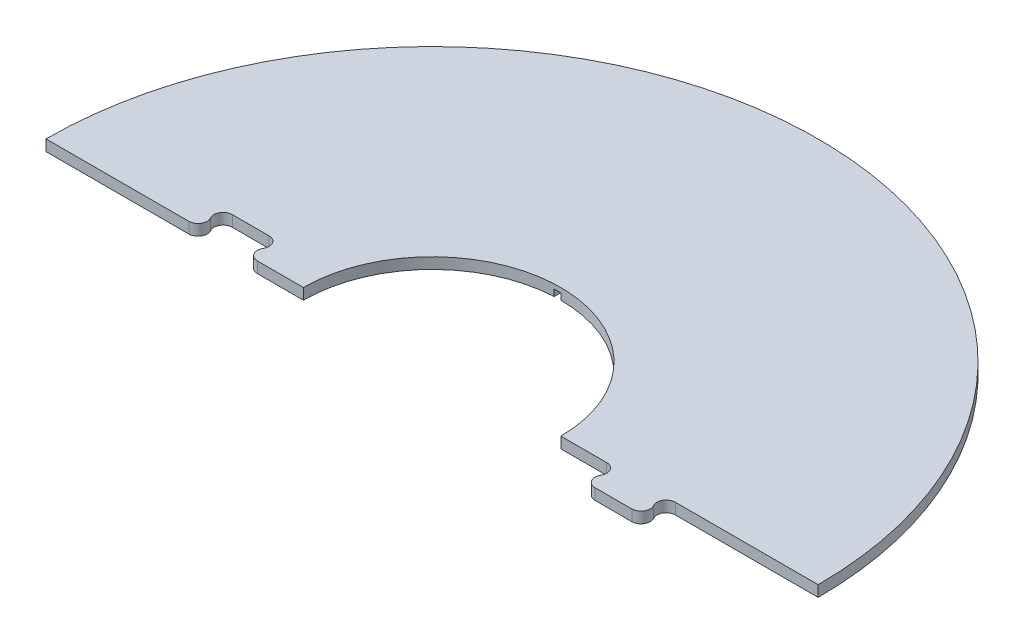
ISO-10303-21;
HEADER;
FILE_DESCRIPTION(('STEP AP214'),'2;1');
FILE_NAME('part.step','',(''),(''),'','','');
FILE_SCHEMA(('AUTOMOTIVE_DESIGN { 1 0 10303 214 1 1 1 1 }'));
ENDSEC;
DATA;
#1=APPLICATION_CONTEXT('core data for automotive mechanical design processes');
#2=APPLICATION_PROTOCOL_DEFINITION('international standard','automotive_design',2000,#1);
#3=PRODUCT_CONTEXT('',#1,'mechanical');
#4=PRODUCT('Part','Part','',(#3));
#5=PRODUCT_RELATED_PRODUCT_CATEGORY('part','',(#4));
#6=PRODUCT_DEFINITION_FORMATION('','',#4);
#7=PRODUCT_DEFINITION_CONTEXT('part definition',#1,'design');
#8=PRODUCT_DEFINITION('design','',#6,#7);
#9=PRODUCT_DEFINITION_SHAPE('','',#8);
#10=(LENGTH_UNIT() NAMED_UNIT(*) SI_UNIT(.MILLI.,.METRE.));
#11=(NAMED_UNIT(*) PLANE_ANGLE_UNIT() SI_UNIT($,.RADIAN.));
#12=(NAMED_UNIT(*) SI_UNIT($,.STERADIAN.) SOLID_ANGLE_UNIT());
#13=UNCERTAINTY_MEASURE_WITH_UNIT(LENGTH_MEASURE(1.E-05),#10,'distance_accuracy_value','');
#14=(GEOMETRIC_REPRESENTATION_CONTEXT(3) GLOBAL_UNCERTAINTY_ASSIGNED_CONTEXT((#13)) GLOBAL_UNIT_ASSIGNED_CONTEXT((#10,
#11,#12)) REPRESENTATION_CONTEXT('',''));
#15=CARTESIAN_POINT('',(0.,0.,0.));
#16=DIRECTION('',(0.,0.,1.));
#17=DIRECTION('',(1.,0.,0.));
#18=AXIS2_PLACEMENT_3D('',#15,#16,#17);
#19=CARTESIAN_POINT('',(0.,12.,0.));
#20=DIRECTION('',(0.,-1.,0.));
#21=DIRECTION('',(0.,0.,-1.));
#22=AXIS2_PLACEMENT_3D('',#19,#20,#21);
#23=CYLINDRICAL_SURFACE('',#22,420.);
#24=DIRECTION('',(0.,-1.,0.));
#25=VECTOR('',#24,1.);
#26=CARTESIAN_POINT('',(0.,7.,-420.));
#27=LINE('',#26,#25);
#28=CARTESIAN_POINT('',(0.,7.,-420.));
#29=VERTEX_POINT('',#28);
#30=CARTESIAN_POINT('',(0.,0.,-420.));
#31=VERTEX_POINT('',#30);
#32=EDGE_CURVE('E328',#29,#31,#27,.T.);
#33=ORIENTED_EDGE('',*,*,#32,.F.);
#34=CARTESIAN_POINT('',(0.,7.,0.));
#35=DIRECTION('',(0.,-1.,0.));
#36=DIRECTION('',(0.,0.,-1.));
#37=AXIS2_PLACEMENT_3D('',#34,#35,#36);
#38=CIRCLE('',#37,420.);
#39=CARTESIAN_POINT('',(-7.,7.,-419.941662615178));
#40=VERTEX_POINT('',#39);
#41=EDGE_CURVE('E323',#40,#29,#38,.T.);
#42=ORIENTED_EDGE('',*,*,#41,.F.);
#43=DIRECTION('',(0.,-1.,0.));
#44=VECTOR('',#43,1.);
#45=CARTESIAN_POINT('',(-7.,7.,-419.941662615178));
#46=LINE('',#45,#44);
#47=CARTESIAN_POINT('',(-7.,0.,-419.941662615178));
#48=VERTEX_POINT('',#47);
#49=EDGE_CURVE('E325',#40,#48,#46,.T.);
#50=ORIENTED_EDGE('',*,*,#49,.T.);
#51=CARTESIAN_POINT('',(0.,0.,0.));
#52=DIRECTION('',(0.,1.,0.));
#53=DIRECTION('',(0.,0.,1.));
#54=AXIS2_PLACEMENT_3D('',#51,#52,#53);
#55=CIRCLE('',#54,420.);
#56=CARTESIAN_POINT('',(-420.,0.,0.));
#57=VERTEX_POINT('',#56);
#58=EDGE_CURVE('E193',#48,#57,#55,.T.);
#59=ORIENTED_EDGE('',*,*,#58,.T.);
#60=DIRECTION('',(0.,-1.,0.));
#61=VECTOR('',#60,1.);
#62=CARTESIAN_POINT('',(-420.,12.,0.));
#63=LINE('',#62,#61);
#64=CARTESIAN_POINT('',(-420.,12.,0.));
#65=VERTEX_POINT('',#64);
#66=EDGE_CURVE('E11',#65,#57,#63,.T.);
#67=ORIENTED_EDGE('',*,*,#66,.F.);
#68=CARTESIAN_POINT('',(0.,12.,0.));
#69=DIRECTION('',(0.,1.,0.));
#70=DIRECTION('',(0.,0.,1.));
#71=AXIS2_PLACEMENT_3D('',#68,#69,#70);
#72=CIRCLE('',#71,420.);
#73=CARTESIAN_POINT('',(420.,12.,2.19641969265707E-06));
#74=VERTEX_POINT('',#73);
#75=EDGE_CURVE('E223',#74,#65,#72,.T.);
#76=ORIENTED_EDGE('',*,*,#75,.F.);
#77=DIRECTION('',(0.,-1.,0.));
#78=VECTOR('',#77,1.);
#79=CARTESIAN_POINT('',(420.,12.,2.19641969265707E-06));
#80=LINE('',#79,#78);
#81=CARTESIAN_POINT('',(420.,0.,2.19641969265707E-06));
#82=VERTEX_POINT('',#81);
#83=EDGE_CURVE('E185',#74,#82,#80,.T.);
#84=ORIENTED_EDGE('',*,*,#83,.T.);
#85=EDGE_CURVE('E189',#82,#31,#55,.T.);
#86=ORIENTED_EDGE('',*,*,#85,.T.);
#87=EDGE_LOOP('',(#33,#42,#50,#59,#67,#76,#84,#86));
#88=FACE_BOUND('',#87,.T.);
#89=ADVANCED_FACE('F33',(#88),#23,.T.);
#90=CARTESIAN_POINT('',(0.,12.,0.));
#91=DIRECTION('',(0.,-1.,0.));
#92=DIRECTION('',(0.,0.,-1.));
#93=AXIS2_PLACEMENT_3D('',#90,#91,#92);
#94=CYLINDRICAL_SURFACE('',#93,140.);
#95=DIRECTION('',(0.,-1.,0.));
#96=VECTOR('',#95,1.);
#97=CARTESIAN_POINT('',(0.,7.,-140.));
#98=LINE('',#97,#96);
#99=CARTESIAN_POINT('',(0.,7.,-140.));
#100=VERTEX_POINT('',#99);
#101=CARTESIAN_POINT('',(0.,0.,-140.));
#102=VERTEX_POINT('',#101);
#103=EDGE_CURVE('E320',#100,#102,#98,.T.);
#104=ORIENTED_EDGE('',*,*,#103,.T.);
#105=CARTESIAN_POINT('',(0.,0.,0.));
#106=DIRECTION('',(0.,-1.,0.));
#107=DIRECTION('',(0.,0.,1.));
#108=AXIS2_PLACEMENT_3D('',#105,#106,#107);
#109=CIRCLE('',#108,140.);
#110=CARTESIAN_POINT('',(140.,0.,2.13909844029186E-06));
#111=VERTEX_POINT('',#110);
#112=EDGE_CURVE('E207',#102,#111,#109,.T.);
#113=ORIENTED_EDGE('',*,*,#112,.T.);
#114=DIRECTION('',(0.,-1.,0.));
#115=VECTOR('',#114,1.);
#116=CARTESIAN_POINT('',(140.,12.,2.13909844029186E-06));
#117=LINE('',#116,#115);
#118=CARTESIAN_POINT('',(140.,12.,2.13909844029186E-06));
#119=VERTEX_POINT('',#118);
#120=EDGE_CURVE('E236',#119,#111,#117,.T.);
#121=ORIENTED_EDGE('',*,*,#120,.F.);
#122=CARTESIAN_POINT('',(0.,12.,0.));
#123=DIRECTION('',(0.,-1.,0.));
#124=DIRECTION('',(0.,0.,1.));
#125=AXIS2_PLACEMENT_3D('',#122,#123,#124);
#126=CIRCLE('',#125,140.);
#127=CARTESIAN_POINT('',(-140.,12.,0.));
#128=VERTEX_POINT('',#127);
#129=EDGE_CURVE('E291',#128,#119,#126,.T.);
#130=ORIENTED_EDGE('',*,*,#129,.F.);
#131=DIRECTION('',(0.,-1.,0.));
#132=VECTOR('',#131,1.);
#133=CARTESIAN_POINT('',(-140.,12.,0.));
#134=LINE('',#133,#132);
#135=CARTESIAN_POINT('',(-140.,0.,0.));
#136=VERTEX_POINT('',#135);
#137=EDGE_CURVE('E239',#128,#136,#134,.T.);
#138=ORIENTED_EDGE('',*,*,#137,.T.);
#139=CARTESIAN_POINT('',(-7.,0.,-139.824890488067));
#140=VERTEX_POINT('',#139);
#141=EDGE_CURVE('E208',#136,#140,#109,.T.);
#142=ORIENTED_EDGE('',*,*,#141,.T.);
#143=DIRECTION('',(0.,-1.,0.));
#144=VECTOR('',#143,1.);
#145=CARTESIAN_POINT('',(-7.,7.,-139.824890488067));
#146=LINE('',#145,#144);
#147=CARTESIAN_POINT('',(-7.,7.,-139.824890488067));
#148=VERTEX_POINT('',#147);
#149=EDGE_CURVE('E47',#148,#140,#146,.T.);
#150=ORIENTED_EDGE('',*,*,#149,.F.);
#151=CARTESIAN_POINT('',(0.,7.,0.));
#152=DIRECTION('',(0.,-1.,0.));
#153=DIRECTION('',(0.,0.,-1.));
#154=AXIS2_PLACEMENT_3D('',#151,#152,#153);
#155=CIRCLE('',#154,140.);
#156=EDGE_CURVE('E341',#100,#148,#155,.F.);
#157=ORIENTED_EDGE('',*,*,#156,.F.);
#158=EDGE_LOOP('',(#104,#113,#121,#130,#138,#142,#150,#157));
#159=FACE_BOUND('',#158,.T.);
#160=ADVANCED_FACE('F363',(#159),#94,.F.);
#161=CARTESIAN_POINT('',(0.,0.,0.));
#162=DIRECTION('',(0.,1.,0.));
#163=DIRECTION('',(0.,0.,1.));
#164=AXIS2_PLACEMENT_3D('',#161,#162,#163);
#165=PLANE('',#164);
#166=DIRECTION('',(0.,0.,-1.));
#167=VECTOR('',#166,1.);
#168=CARTESIAN_POINT('',(0.,0.,0.));
#169=LINE('',#168,#167);
#170=EDGE_CURVE('E334',#102,#31,#169,.T.);
#171=ORIENTED_EDGE('',*,*,#170,.T.);
#172=ORIENTED_EDGE('',*,*,#85,.F.);
#173=DIRECTION('',(1.,0.,2.04718433056436E-10));
#174=VECTOR('',#173,1.);
#175=CARTESIAN_POINT('',(420.,0.,2.19641969265707E-06));
#176=LINE('',#175,#174);
#177=CARTESIAN_POINT('',(264.641016151378,0.,2.1646148606197E-06));
#178=VERTEX_POINT('',#177);
#179=EDGE_CURVE('E113',#178,#82,#176,.T.);
#180=ORIENTED_EDGE('',*,*,#179,.F.);
#181=CARTESIAN_POINT('',(264.64101614933,0.,10.0000021646148));
#182=DIRECTION('',(0.,-1.,0.));
#183=DIRECTION('',(0.,0.,-1.));
#184=AXIS2_PLACEMENT_3D('',#181,#182,#183);
#185=CIRCLE('',#184,9.99999999999998);
#186=CARTESIAN_POINT('',(255.980762110463,0.,15.000002162842));
#187=VERTEX_POINT('',#186);
#188=EDGE_CURVE('E220',#187,#178,#185,.T.);
#189=ORIENTED_EDGE('',*,*,#188,.F.);
#190=CARTESIAN_POINT('',(247.320508071594,0.,20.000002161069));
#191=DIRECTION('',(0.,1.,0.));
#192=DIRECTION('',(0.,0.,1.));
#193=AXIS2_PLACEMENT_3D('',#190,#191,#192);
#194=CIRCLE('',#193,10.);
#195=CARTESIAN_POINT('',(247.320508069547,0.,30.000002161069));
#196=VERTEX_POINT('',#195);
#197=EDGE_CURVE('E177',#196,#187,#194,.T.);
#198=ORIENTED_EDGE('',*,*,#197,.F.);
#199=DIRECTION('',(1.,0.,2.04718794000192E-10));
#200=VECTOR('',#199,1.);
#201=CARTESIAN_POINT('',(207.320508069547,0.,30.0000021528803));
#202=LINE('',#201,#200);
#203=CARTESIAN_POINT('',(207.320508069547,0.,30.0000021528803));
#204=VERTEX_POINT('',#203);
#205=EDGE_CURVE('E217',#204,#196,#202,.T.);
#206=ORIENTED_EDGE('',*,*,#205,.F.);
#207=CARTESIAN_POINT('',(207.320508071594,0.,20.0000021528802));
#208=DIRECTION('',(0.,1.,0.));
#209=DIRECTION('',(0.,0.,-1.));
#210=AXIS2_PLACEMENT_3D('',#207,#208,#209);
#211=CIRCLE('',#210,10.);
#212=CARTESIAN_POINT('',(198.660254034774,0.,15.0000021511073));
#213=VERTEX_POINT('',#212);
#214=EDGE_CURVE('E215',#213,#204,#211,.T.);
#215=ORIENTED_EDGE('',*,*,#214,.F.);
#216=CARTESIAN_POINT('',(189.999999997953,0.,10.0000021493344));
#217=DIRECTION('',(0.,-1.,0.));
#218=DIRECTION('',(0.,0.,-1.));
#219=AXIS2_PLACEMENT_3D('',#216,#217,#218);
#220=CIRCLE('',#219,10.);
#221=CARTESIAN_POINT('',(190.,0.,2.14933444157348E-06));
#222=VERTEX_POINT('',#221);
#223=EDGE_CURVE('E213',#222,#213,#220,.T.);
#224=ORIENTED_EDGE('',*,*,#223,.F.);
#225=DIRECTION('',(1.,0.,2.04719746806767E-10));
#226=VECTOR('',#225,1.);
#227=CARTESIAN_POINT('',(190.,0.,2.14933444157348E-06));
#228=LINE('',#227,#226);
#229=EDGE_CURVE('E211',#111,#222,#228,.T.);
#230=ORIENTED_EDGE('',*,*,#229,.F.);
#231=ORIENTED_EDGE('',*,*,#112,.F.);
#232=EDGE_LOOP('',(#171,#172,#180,#189,#198,#206,#215,#224,#230,#231));
#233=FACE_BOUND('',#232,.T.);
#234=ADVANCED_FACE('F310',(#233),#165,.F.);
#235=CARTESIAN_POINT('',(-420.,12.,0.));
#236=DIRECTION('',(0.,0.,-1.));
#237=DIRECTION('',(-1.,0.,0.));
#238=AXIS2_PLACEMENT_3D('',#235,#236,#237);
#239=PLANE('',#238);
#240=DIRECTION('',(1.,0.,0.));
#241=VECTOR('',#240,1.);
#242=CARTESIAN_POINT('',(-420.,0.,0.));
#243=LINE('',#242,#241);
#244=CARTESIAN_POINT('',(-264.641016151378,0.,0.));
#245=VERTEX_POINT('',#244);
#246=EDGE_CURVE('E192',#57,#245,#243,.T.);
#247=ORIENTED_EDGE('',*,*,#246,.T.);
#248=DIRECTION('',(0.,-1.,0.));
#249=VECTOR('',#248,1.);
#250=CARTESIAN_POINT('',(-264.641016151378,12.,0.));
#251=LINE('',#250,#249);
#252=CARTESIAN_POINT('',(-264.641016151378,12.,0.));
#253=VERTEX_POINT('',#252);
#254=EDGE_CURVE('E40',#253,#245,#251,.T.);
#255=ORIENTED_EDGE('',*,*,#254,.F.);
#256=DIRECTION('',(1.,0.,0.));
#257=VECTOR('',#256,1.);
#258=CARTESIAN_POINT('',(-420.,12.,0.));
#259=LINE('',#258,#257);
#260=EDGE_CURVE('E121',#65,#253,#259,.T.);
#261=ORIENTED_EDGE('',*,*,#260,.F.);
#262=ORIENTED_EDGE('',*,*,#66,.T.);
#263=EDGE_LOOP('',(#247,#255,#261,#262));
#264=FACE_BOUND('',#263,.T.);
#265=ADVANCED_FACE('F409',(#264),#239,.F.);
#266=CARTESIAN_POINT('',(-264.641016151378,12.,-10.));
#267=DIRECTION('',(0.,-1.,0.));
#268=DIRECTION('',(0.,0.,-1.));
#269=AXIS2_PLACEMENT_3D('',#266,#267,#268);
#270=CYLINDRICAL_SURFACE('',#269,10.);
#271=CARTESIAN_POINT('',(-264.641016151378,0.,-10.));
#272=DIRECTION('',(0.,1.,0.));
#273=DIRECTION('',(0.,0.,-1.));
#274=AXIS2_PLACEMENT_3D('',#271,#272,#273);
#275=CIRCLE('',#274,10.);
#276=CARTESIAN_POINT('',(-255.980762113533,0.,-15.));
#277=VERTEX_POINT('',#276);
#278=EDGE_CURVE('E195',#245,#277,#275,.T.);
#279=ORIENTED_EDGE('',*,*,#278,.T.);
#280=DIRECTION('',(0.,-1.,0.));
#281=VECTOR('',#280,1.);
#282=CARTESIAN_POINT('',(-255.980762113533,12.,-15.));
#283=LINE('',#282,#281);
#284=CARTESIAN_POINT('',(-255.980762113533,12.,-15.));
#285=VERTEX_POINT('',#284);
#286=EDGE_CURVE('E254',#285,#277,#283,.T.);
#287=ORIENTED_EDGE('',*,*,#286,.F.);
#288=CARTESIAN_POINT('',(-264.641016151378,12.,-10.));
#289=DIRECTION('',(0.,1.,0.));
#290=DIRECTION('',(0.,0.,-1.));
#291=AXIS2_PLACEMENT_3D('',#288,#289,#290);
#292=CIRCLE('',#291,10.);
#293=EDGE_CURVE('E262',#253,#285,#292,.T.);
#294=ORIENTED_EDGE('',*,*,#293,.F.);
#295=ORIENTED_EDGE('',*,*,#254,.T.);
#296=EDGE_LOOP('',(#279,#287,#294,#295));
#297=FACE_BOUND('',#296,.T.);
#298=ADVANCED_FACE('F260',(#297),#270,.T.);
#299=CARTESIAN_POINT('',(-247.320508075689,12.,-20.));
#300=DIRECTION('',(0.,-1.,0.));
#301=DIRECTION('',(0.,0.,-1.));
#302=AXIS2_PLACEMENT_3D('',#299,#300,#301);
#303=CYLINDRICAL_SURFACE('',#302,9.99999999999999);
#304=CARTESIAN_POINT('',(-247.320508075689,0.,-20.));
#305=DIRECTION('',(0.,-1.,0.));
#306=DIRECTION('',(0.,0.,1.));
#307=AXIS2_PLACEMENT_3D('',#304,#305,#306);
#308=CIRCLE('',#307,9.99999999999999);
#309=CARTESIAN_POINT('',(-247.320508075689,0.,-30.));
#310=VERTEX_POINT('',#309);
#311=EDGE_CURVE('E197',#277,#310,#308,.T.);
#312=ORIENTED_EDGE('',*,*,#311,.T.);
#313=DIRECTION('',(0.,-1.,0.));
#314=VECTOR('',#313,1.);
#315=CARTESIAN_POINT('',(-247.320508075689,12.,-30.));
#316=LINE('',#315,#314);
#317=CARTESIAN_POINT('',(-247.320508075689,12.,-30.));
#318=VERTEX_POINT('',#317);
#319=EDGE_CURVE('E251',#318,#310,#316,.T.);
#320=ORIENTED_EDGE('',*,*,#319,.F.);
#321=CARTESIAN_POINT('',(-247.320508075689,12.,-20.));
#322=DIRECTION('',(0.,-1.,0.));
#323=DIRECTION('',(0.,0.,1.));
#324=AXIS2_PLACEMENT_3D('',#321,#322,#323);
#325=CIRCLE('',#324,9.99999999999999);
#326=EDGE_CURVE('E281',#285,#318,#325,.T.);
#327=ORIENTED_EDGE('',*,*,#326,.F.);
#328=ORIENTED_EDGE('',*,*,#286,.T.);
#329=EDGE_LOOP('',(#312,#320,#327,#328));
#330=FACE_BOUND('',#329,.T.);
#331=ADVANCED_FACE('F272',(#330),#303,.F.);
#332=CARTESIAN_POINT('',(-207.320508075689,12.,-30.));
#333=DIRECTION('',(0.,0.,-1.));
#334=DIRECTION('',(-1.,0.,0.));
#335=AXIS2_PLACEMENT_3D('',#332,#333,#334);
#336=PLANE('',#335);
#337=DIRECTION('',(1.,0.,0.));
#338=VECTOR('',#337,1.);
#339=CARTESIAN_POINT('',(-207.320508075689,0.,-30.));
#340=LINE('',#339,#338);
#341=CARTESIAN_POINT('',(-207.320508075689,0.,-30.));
#342=VERTEX_POINT('',#341);
#343=EDGE_CURVE('E199',#310,#342,#340,.T.);
#344=ORIENTED_EDGE('',*,*,#343,.T.);
#345=DIRECTION('',(0.,-1.,0.));
#346=VECTOR('',#345,1.);
#347=CARTESIAN_POINT('',(-207.320508075689,12.,-30.));
#348=LINE('',#347,#346);
#349=CARTESIAN_POINT('',(-207.320508075689,12.,-30.));
#350=VERTEX_POINT('',#349);
#351=EDGE_CURVE('E248',#350,#342,#348,.T.);
#352=ORIENTED_EDGE('',*,*,#351,.F.);
#353=DIRECTION('',(1.,0.,0.));
#354=VECTOR('',#353,1.);
#355=CARTESIAN_POINT('',(-207.320508075689,12.,-30.));
#356=LINE('',#355,#354);
#357=EDGE_CURVE('E278',#318,#350,#356,.T.);
#358=ORIENTED_EDGE('',*,*,#357,.F.);
#359=ORIENTED_EDGE('',*,*,#319,.T.);
#360=EDGE_LOOP('',(#344,#352,#358,#359));
#361=FACE_BOUND('',#360,.T.);
#362=ADVANCED_FACE('F276',(#361),#336,.F.);
#363=CARTESIAN_POINT('',(-207.320508075689,12.,-20.));
#364=DIRECTION('',(0.,-1.,0.));
#365=DIRECTION('',(0.,0.,-1.));
#366=AXIS2_PLACEMENT_3D('',#363,#364,#365);
#367=CYLINDRICAL_SURFACE('',#366,10.);
#368=CARTESIAN_POINT('',(-207.320508075689,0.,-20.));
#369=DIRECTION('',(0.,-1.,0.));
#370=DIRECTION('',(0.,0.,-1.));
#371=AXIS2_PLACEMENT_3D('',#368,#369,#370);
#372=CIRCLE('',#371,10.);
#373=CARTESIAN_POINT('',(-198.660254037844,0.,-15.));
#374=VERTEX_POINT('',#373);
#375=EDGE_CURVE('E201',#342,#374,#372,.T.);
#376=ORIENTED_EDGE('',*,*,#375,.T.);
#377=DIRECTION('',(0.,-1.,0.));
#378=VECTOR('',#377,1.);
#379=CARTESIAN_POINT('',(-198.660254037844,12.,-15.));
#380=LINE('',#379,#378);
#381=CARTESIAN_POINT('',(-198.660254037844,12.,-15.));
#382=VERTEX_POINT('',#381);
#383=EDGE_CURVE('E245',#382,#374,#380,.T.);
#384=ORIENTED_EDGE('',*,*,#383,.F.);
#385=CARTESIAN_POINT('',(-207.320508075689,12.,-20.));
#386=DIRECTION('',(0.,-1.,0.));
#387=DIRECTION('',(0.,0.,-1.));
#388=AXIS2_PLACEMENT_3D('',#385,#386,#387);
#389=CIRCLE('',#388,10.);
#390=EDGE_CURVE('E280',#350,#382,#389,.T.);
#391=ORIENTED_EDGE('',*,*,#390,.F.);
#392=ORIENTED_EDGE('',*,*,#351,.T.);
#393=EDGE_LOOP('',(#376,#384,#391,#392));
#394=FACE_BOUND('',#393,.T.);
#395=ADVANCED_FACE('F385',(#394),#367,.F.);
#396=CARTESIAN_POINT('',(-190.,12.,-10.));
#397=DIRECTION('',(0.,-1.,0.));
#398=DIRECTION('',(0.,0.,-1.));
#399=AXIS2_PLACEMENT_3D('',#396,#397,#398);
#400=CYLINDRICAL_SURFACE('',#399,10.);
#401=CARTESIAN_POINT('',(-190.,0.,-10.));
#402=DIRECTION('',(0.,1.,0.));
#403=DIRECTION('',(0.,0.,-1.));
#404=AXIS2_PLACEMENT_3D('',#401,#402,#403);
#405=CIRCLE('',#404,10.);
#406=CARTESIAN_POINT('',(-190.,0.,0.));
#407=VERTEX_POINT('',#406);
#408=EDGE_CURVE('E203',#374,#407,#405,.T.);
#409=ORIENTED_EDGE('',*,*,#408,.T.);
#410=DIRECTION('',(0.,-1.,0.));
#411=VECTOR('',#410,1.);
#412=CARTESIAN_POINT('',(-190.,12.,0.));
#413=LINE('',#412,#411);
#414=CARTESIAN_POINT('',(-190.,12.,0.));
#415=VERTEX_POINT('',#414);
#416=EDGE_CURVE('E242',#415,#407,#413,.T.);
#417=ORIENTED_EDGE('',*,*,#416,.F.);
#418=CARTESIAN_POINT('',(-190.,12.,-10.));
#419=DIRECTION('',(0.,1.,0.));
#420=DIRECTION('',(0.,0.,-1.));
#421=AXIS2_PLACEMENT_3D('',#418,#419,#420);
#422=CIRCLE('',#421,10.);
#423=EDGE_CURVE('E283',#382,#415,#422,.T.);
#424=ORIENTED_EDGE('',*,*,#423,.F.);
#425=ORIENTED_EDGE('',*,*,#383,.T.);
#426=EDGE_LOOP('',(#409,#417,#424,#425));
#427=FACE_BOUND('',#426,.T.);
#428=ADVANCED_FACE('F381',(#427),#400,.T.);
#429=CARTESIAN_POINT('',(-190.,12.,0.));
#430=DIRECTION('',(0.,0.,-1.));
#431=DIRECTION('',(-1.,0.,0.));
#432=AXIS2_PLACEMENT_3D('',#429,#430,#431);
#433=PLANE('',#432);
#434=DIRECTION('',(1.,0.,0.));
#435=VECTOR('',#434,1.);
#436=CARTESIAN_POINT('',(-190.,0.,0.));
#437=LINE('',#436,#435);
#438=EDGE_CURVE('E205',#407,#136,#437,.T.);
#439=ORIENTED_EDGE('',*,*,#438,.T.);
#440=ORIENTED_EDGE('',*,*,#137,.F.);
#441=DIRECTION('',(1.,0.,0.));
#442=VECTOR('',#441,1.);
#443=CARTESIAN_POINT('',(-190.,12.,0.));
#444=LINE('',#443,#442);
#445=EDGE_CURVE('E289',#415,#128,#444,.T.);
#446=ORIENTED_EDGE('',*,*,#445,.F.);
#447=ORIENTED_EDGE('',*,*,#416,.T.);
#448=EDGE_LOOP('',(#439,#440,#446,#447));
#449=FACE_BOUND('',#448,.T.);
#450=ADVANCED_FACE('F377',(#449),#433,.F.);
#451=CARTESIAN_POINT('',(190.,12.,2.14933444157348E-06));
#452=DIRECTION('',(2.04719746806767E-10,0.,-1.));
#453=DIRECTION('',(-1.,0.,-2.04719746806767E-10));
#454=AXIS2_PLACEMENT_3D('',#451,#452,#453);
#455=PLANE('',#454);
#456=ORIENTED_EDGE('',*,*,#229,.T.);
#457=DIRECTION('',(0.,-1.,0.));
#458=VECTOR('',#457,1.);
#459=CARTESIAN_POINT('',(190.,12.,2.14933444157348E-06));
#460=LINE('',#459,#458);
#461=CARTESIAN_POINT('',(190.,12.,2.14933444157348E-06));
#462=VERTEX_POINT('',#461);
#463=EDGE_CURVE('E233',#462,#222,#460,.T.);
#464=ORIENTED_EDGE('',*,*,#463,.F.);
#465=DIRECTION('',(1.,0.,2.04719746806767E-10));
#466=VECTOR('',#465,1.);
#467=CARTESIAN_POINT('',(190.,12.,2.14933444157348E-06));
#468=LINE('',#467,#466);
#469=EDGE_CURVE('E293',#119,#462,#468,.T.);
#470=ORIENTED_EDGE('',*,*,#469,.F.);
#471=ORIENTED_EDGE('',*,*,#120,.T.);
#472=EDGE_LOOP('',(#456,#464,#470,#471));
#473=FACE_BOUND('',#472,.T.);
#474=ADVANCED_FACE('F389',(#473),#455,.F.);
#475=CARTESIAN_POINT('',(189.999999997953,12.,10.0000021493344));
#476=DIRECTION('',(0.,-1.,0.));
#477=DIRECTION('',(0.,0.,-1.));
#478=AXIS2_PLACEMENT_3D('',#475,#476,#477);
#479=CYLINDRICAL_SURFACE('',#478,10.);
#480=ORIENTED_EDGE('',*,*,#223,.T.);
#481=DIRECTION('',(0.,-1.,0.));
#482=VECTOR('',#481,1.);
#483=CARTESIAN_POINT('',(198.660254034774,12.,15.0000021511073));
#484=LINE('',#483,#482);
#485=CARTESIAN_POINT('',(198.660254034774,12.,15.0000021511073));
#486=VERTEX_POINT('',#485);
#487=EDGE_CURVE('E230',#486,#213,#484,.T.);
#488=ORIENTED_EDGE('',*,*,#487,.F.);
#489=CARTESIAN_POINT('',(189.999999997953,12.,10.0000021493344));
#490=DIRECTION('',(0.,-1.,0.));
#491=DIRECTION('',(0.,0.,-1.));
#492=AXIS2_PLACEMENT_3D('',#489,#490,#491);
#493=CIRCLE('',#492,10.);
#494=EDGE_CURVE('E295',#462,#486,#493,.T.);
#495=ORIENTED_EDGE('',*,*,#494,.F.);
#496=ORIENTED_EDGE('',*,*,#463,.T.);
#497=EDGE_LOOP('',(#480,#488,#495,#496));
#498=FACE_BOUND('',#497,.T.);
#499=ADVANCED_FACE('F392',(#498),#479,.F.);
#500=CARTESIAN_POINT('',(207.320508071594,12.,20.0000021528802));
#501=DIRECTION('',(0.,-1.,0.));
#502=DIRECTION('',(0.,0.,-1.));
#503=AXIS2_PLACEMENT_3D('',#500,#501,#502);
#504=CYLINDRICAL_SURFACE('',#503,10.);
#505=ORIENTED_EDGE('',*,*,#214,.T.);
#506=DIRECTION('',(0.,-1.,0.));
#507=VECTOR('',#506,1.);
#508=CARTESIAN_POINT('',(207.320508069547,12.,30.0000021528803));
#509=LINE('',#508,#507);
#510=CARTESIAN_POINT('',(207.320508069547,12.,30.0000021528803));
#511=VERTEX_POINT('',#510);
#512=EDGE_CURVE('E227',#511,#204,#509,.T.);
#513=ORIENTED_EDGE('',*,*,#512,.F.);
#514=CARTESIAN_POINT('',(207.320508071594,12.,20.0000021528802));
#515=DIRECTION('',(0.,1.,0.));
#516=DIRECTION('',(0.,0.,-1.));
#517=AXIS2_PLACEMENT_3D('',#514,#515,#516);
#518=CIRCLE('',#517,10.);
#519=EDGE_CURVE('E297',#486,#511,#518,.T.);
#520=ORIENTED_EDGE('',*,*,#519,.F.);
#521=ORIENTED_EDGE('',*,*,#487,.T.);
#522=EDGE_LOOP('',(#505,#513,#520,#521));
#523=FACE_BOUND('',#522,.T.);
#524=ADVANCED_FACE('F303',(#523),#504,.T.);
#525=CARTESIAN_POINT('',(207.320508069547,12.,30.0000021528803));
#526=DIRECTION('',(2.04718794000192E-10,0.,-1.));
#527=DIRECTION('',(-1.,0.,-2.04718794000192E-10));
#528=AXIS2_PLACEMENT_3D('',#525,#526,#527);
#529=PLANE('',#528);
#530=ORIENTED_EDGE('',*,*,#205,.T.);
#531=DIRECTION('',(0.,-1.,0.));
#532=VECTOR('',#531,1.);
#533=CARTESIAN_POINT('',(247.320508069547,12.,30.000002161069));
#534=LINE('',#533,#532);
#535=CARTESIAN_POINT('',(247.320508069547,12.,30.000002161069));
#536=VERTEX_POINT('',#535);
#537=EDGE_CURVE('E180',#536,#196,#534,.T.);
#538=ORIENTED_EDGE('',*,*,#537,.F.);
#539=DIRECTION('',(1.,0.,2.04718794000192E-10));
#540=VECTOR('',#539,1.);
#541=CARTESIAN_POINT('',(207.320508069547,12.,30.0000021528803));
#542=LINE('',#541,#540);
#543=EDGE_CURVE('E168',#511,#536,#542,.T.);
#544=ORIENTED_EDGE('',*,*,#543,.F.);
#545=ORIENTED_EDGE('',*,*,#512,.T.);
#546=EDGE_LOOP('',(#530,#538,#544,#545));
#547=FACE_BOUND('',#546,.T.);
#548=ADVANCED_FACE('F307',(#547),#529,.F.);
#549=CARTESIAN_POINT('',(247.320508071594,12.,20.000002161069));
#550=DIRECTION('',(0.,-1.,0.));
#551=DIRECTION('',(0.,0.,-1.));
#552=AXIS2_PLACEMENT_3D('',#549,#550,#551);
#553=CYLINDRICAL_SURFACE('',#552,10.);
#554=ORIENTED_EDGE('',*,*,#197,.T.);
#555=DIRECTION('',(0.,-1.,0.));
#556=VECTOR('',#555,1.);
#557=CARTESIAN_POINT('',(255.980762110463,12.,15.000002162842));
#558=LINE('',#557,#556);
#559=CARTESIAN_POINT('',(255.980762110463,12.,15.000002162842));
#560=VERTEX_POINT('',#559);
#561=EDGE_CURVE('E174',#560,#187,#558,.T.);
#562=ORIENTED_EDGE('',*,*,#561,.F.);
#563=CARTESIAN_POINT('',(247.320508071594,12.,20.000002161069));
#564=DIRECTION('',(0.,1.,0.));
#565=DIRECTION('',(0.,0.,1.));
#566=AXIS2_PLACEMENT_3D('',#563,#564,#565);
#567=CIRCLE('',#566,10.);
#568=EDGE_CURVE('E161',#536,#560,#567,.T.);
#569=ORIENTED_EDGE('',*,*,#568,.F.);
#570=ORIENTED_EDGE('',*,*,#537,.T.);
#571=EDGE_LOOP('',(#554,#562,#569,#570));
#572=FACE_BOUND('',#571,.T.);
#573=ADVANCED_FACE('F175',(#572),#553,.T.);
#574=CARTESIAN_POINT('',(264.64101614933,12.,10.0000021646148));
#575=DIRECTION('',(0.,-1.,0.));
#576=DIRECTION('',(0.,0.,-1.));
#577=AXIS2_PLACEMENT_3D('',#574,#575,#576);
#578=CYLINDRICAL_SURFACE('',#577,9.99999999999998);
#579=ORIENTED_EDGE('',*,*,#188,.T.);
#580=DIRECTION('',(0.,-1.,0.));
#581=VECTOR('',#580,1.);
#582=CARTESIAN_POINT('',(264.641016151378,12.,2.1646148606197E-06));
#583=LINE('',#582,#581);
#584=CARTESIAN_POINT('',(264.641016151378,12.,2.1646148606197E-06));
#585=VERTEX_POINT('',#584);
#586=EDGE_CURVE('E181',#585,#178,#583,.T.);
#587=ORIENTED_EDGE('',*,*,#586,.F.);
#588=CARTESIAN_POINT('',(264.64101614933,12.,10.0000021646148));
#589=DIRECTION('',(0.,-1.,0.));
#590=DIRECTION('',(0.,0.,-1.));
#591=AXIS2_PLACEMENT_3D('',#588,#589,#590);
#592=CIRCLE('',#591,9.99999999999998);
#593=EDGE_CURVE('E165',#560,#585,#592,.T.);
#594=ORIENTED_EDGE('',*,*,#593,.F.);
#595=ORIENTED_EDGE('',*,*,#561,.T.);
#596=EDGE_LOOP('',(#579,#587,#594,#595));
#597=FACE_BOUND('',#596,.T.);
#598=ADVANCED_FACE('F183',(#597),#578,.F.);
#599=CARTESIAN_POINT('',(420.,12.,2.19641969265707E-06));
#600=DIRECTION('',(2.04718433056436E-10,0.,-1.));
#601=DIRECTION('',(-1.,0.,-2.04718433056436E-10));
#602=AXIS2_PLACEMENT_3D('',#599,#600,#601);
#603=PLANE('',#602);
#604=ORIENTED_EDGE('',*,*,#179,.T.);
#605=ORIENTED_EDGE('',*,*,#83,.F.);
#606=DIRECTION('',(1.,0.,2.04718433056436E-10));
#607=VECTOR('',#606,1.);
#608=CARTESIAN_POINT('',(420.,12.,2.19641969265707E-06));
#609=LINE('',#608,#607);
#610=EDGE_CURVE('E56',#585,#74,#609,.T.);
#611=ORIENTED_EDGE('',*,*,#610,.F.);
#612=ORIENTED_EDGE('',*,*,#586,.T.);
#613=EDGE_LOOP('',(#604,#605,#611,#612));
#614=FACE_BOUND('',#613,.T.);
#615=ADVANCED_FACE('F312',(#614),#603,.F.);
#616=CARTESIAN_POINT('',(0.,12.,0.));
#617=DIRECTION('',(0.,1.,0.));
#618=DIRECTION('',(0.,0.,1.));
#619=AXIS2_PLACEMENT_3D('',#616,#617,#618);
#620=PLANE('',#619);
#621=ORIENTED_EDGE('',*,*,#75,.T.);
#622=ORIENTED_EDGE('',*,*,#260,.T.);
#623=ORIENTED_EDGE('',*,*,#293,.T.);
#624=ORIENTED_EDGE('',*,*,#326,.T.);
#625=ORIENTED_EDGE('',*,*,#357,.T.);
#626=ORIENTED_EDGE('',*,*,#390,.T.);
#627=ORIENTED_EDGE('',*,*,#423,.T.);
#628=ORIENTED_EDGE('',*,*,#445,.T.);
#629=ORIENTED_EDGE('',*,*,#129,.T.);
#630=ORIENTED_EDGE('',*,*,#469,.T.);
#631=ORIENTED_EDGE('',*,*,#494,.T.);
#632=ORIENTED_EDGE('',*,*,#519,.T.);
#633=ORIENTED_EDGE('',*,*,#543,.T.);
#634=ORIENTED_EDGE('',*,*,#568,.T.);
#635=ORIENTED_EDGE('',*,*,#593,.T.);
#636=ORIENTED_EDGE('',*,*,#610,.T.);
#637=EDGE_LOOP('',(#621,#622,#623,#624,#625,#626,#627,#628,#629,#630,#631,#632,#633,#634,#635,#636));
#638=FACE_BOUND('',#637,.T.);
#639=ADVANCED_FACE('F163',(#638),#620,.T.);
#640=ORIENTED_EDGE('',*,*,#58,.F.);
#641=DIRECTION('',(0.,0.,-1.));
#642=VECTOR('',#641,1.);
#643=CARTESIAN_POINT('',(-7.,0.,0.));
#644=LINE('',#643,#642);
#645=EDGE_CURVE('E331',#140,#48,#644,.T.);
#646=ORIENTED_EDGE('',*,*,#645,.F.);
#647=ORIENTED_EDGE('',*,*,#141,.F.);
#648=ORIENTED_EDGE('',*,*,#438,.F.);
#649=ORIENTED_EDGE('',*,*,#408,.F.);
#650=ORIENTED_EDGE('',*,*,#375,.F.);
#651=ORIENTED_EDGE('',*,*,#343,.F.);
#652=ORIENTED_EDGE('',*,*,#311,.F.);
#653=ORIENTED_EDGE('',*,*,#278,.F.);
#654=ORIENTED_EDGE('',*,*,#246,.F.);
#655=EDGE_LOOP('',(#640,#646,#647,#648,#649,#650,#651,#652,#653,#654));
#656=FACE_BOUND('',#655,.T.);
#657=ADVANCED_FACE('F267',(#656),#165,.F.);
#658=CARTESIAN_POINT('',(0.,7.,0.));
#659=DIRECTION('',(-1.,0.,0.));
#660=DIRECTION('',(0.,0.,1.));
#661=AXIS2_PLACEMENT_3D('',#658,#659,#660);
#662=PLANE('',#661);
#663=ORIENTED_EDGE('',*,*,#170,.F.);
#664=ORIENTED_EDGE('',*,*,#103,.F.);
#665=DIRECTION('',(0.,0.,-1.));
#666=VECTOR('',#665,1.);
#667=CARTESIAN_POINT('',(0.,7.,0.));
#668=LINE('',#667,#666);
#669=EDGE_CURVE('E333',#100,#29,#668,.T.);
#670=ORIENTED_EDGE('',*,*,#669,.T.);
#671=ORIENTED_EDGE('',*,*,#32,.T.);
#672=EDGE_LOOP('',(#663,#664,#670,#671));
#673=FACE_BOUND('',#672,.T.);
#674=ADVANCED_FACE('F349',(#673),#662,.T.);
#675=CARTESIAN_POINT('',(-7.,7.,0.));
#676=DIRECTION('',(-1.,0.,0.));
#677=DIRECTION('',(0.,0.,1.));
#678=AXIS2_PLACEMENT_3D('',#675,#676,#677);
#679=PLANE('',#678);
#680=ORIENTED_EDGE('',*,*,#645,.T.);
#681=ORIENTED_EDGE('',*,*,#49,.F.);
#682=DIRECTION('',(0.,0.,-1.));
#683=VECTOR('',#682,1.);
#684=CARTESIAN_POINT('',(-7.,7.,0.));
#685=LINE('',#684,#683);
#686=EDGE_CURVE('E338',#148,#40,#685,.T.);
#687=ORIENTED_EDGE('',*,*,#686,.F.);
#688=ORIENTED_EDGE('',*,*,#149,.T.);
#689=EDGE_LOOP('',(#680,#681,#687,#688));
#690=FACE_BOUND('',#689,.T.);
#691=ADVANCED_FACE('F370',(#690),#679,.F.);
#692=CARTESIAN_POINT('',(0.,7.,0.));
#693=DIRECTION('',(0.,-1.,0.));
#694=DIRECTION('',(0.,0.,-1.));
#695=AXIS2_PLACEMENT_3D('',#692,#693,#694);
#696=PLANE('',#695);
#697=ORIENTED_EDGE('',*,*,#669,.F.);
#698=ORIENTED_EDGE('',*,*,#156,.T.);
#699=ORIENTED_EDGE('',*,*,#686,.T.);
#700=ORIENTED_EDGE('',*,*,#41,.T.);
#701=EDGE_LOOP('',(#697,#698,#699,#700));
#702=FACE_BOUND('',#701,.T.);
#703=ADVANCED_FACE('F356',(#702),#696,.T.);
#704=CLOSED_SHELL('',(#89,#160,#234,#265,#298,#331,#362,#395,#428,#450,#474,#499,#524,#548,#573,
#598,#615,#639,#657,#674,#691,#703));
#705=MANIFOLD_SOLID_BREP('B2',#704);
#706=ADVANCED_BREP_SHAPE_REPRESENTATION('',(#18,#705),#14);
#707=SHAPE_DEFINITION_REPRESENTATION(#9,#706);
ENDSEC;
END-ISO-10303-21;
